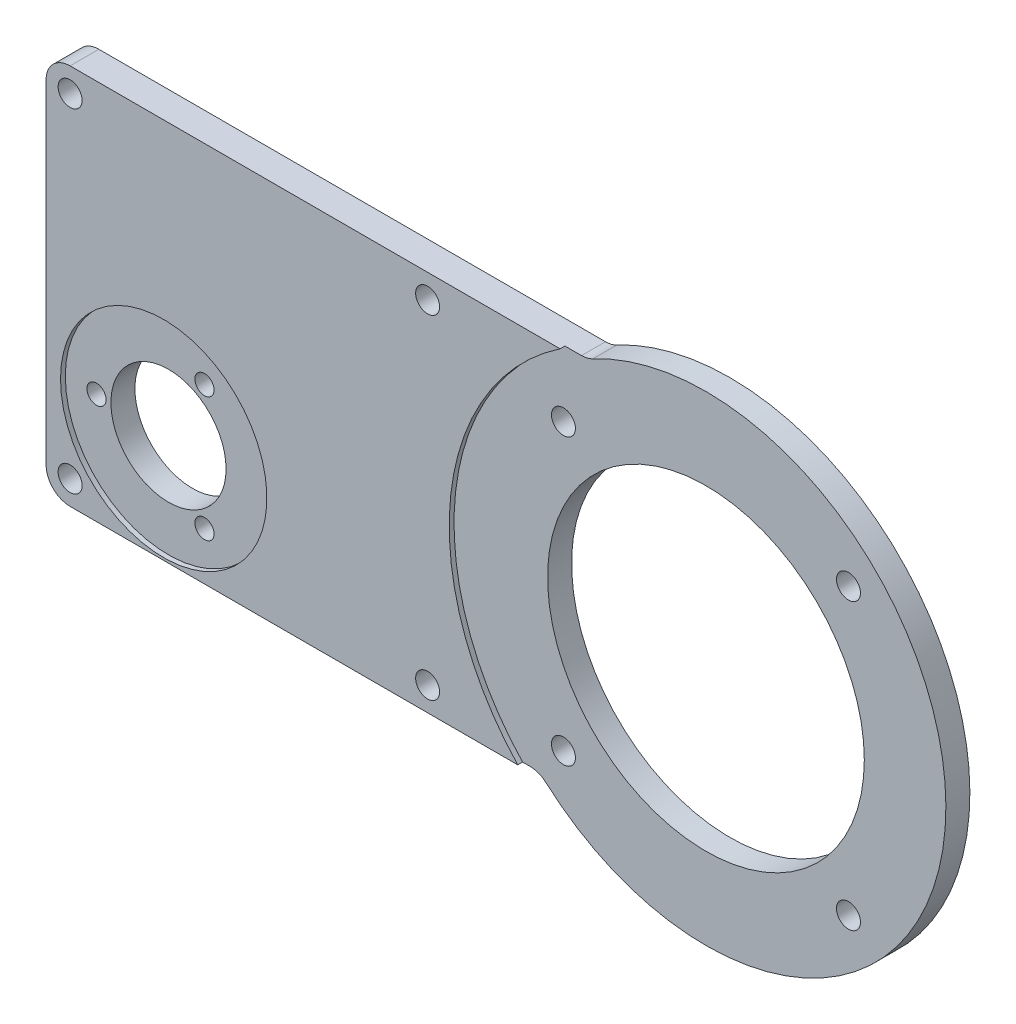
ISO-10303-21;
HEADER;
FILE_DESCRIPTION(('STEP AP214'),'2;1');
FILE_NAME('part.step','',(''),(''),'','','');
FILE_SCHEMA(('AUTOMOTIVE_DESIGN { 1 0 10303 214 1 1 1 1 }'));
ENDSEC;
DATA;
#1=APPLICATION_CONTEXT('core data for automotive mechanical design processes');
#2=APPLICATION_PROTOCOL_DEFINITION('international standard','automotive_design',2000,#1);
#3=PRODUCT_CONTEXT('',#1,'mechanical');
#4=PRODUCT('Part','Part','',(#3));
#5=PRODUCT_RELATED_PRODUCT_CATEGORY('part','',(#4));
#6=PRODUCT_DEFINITION_FORMATION('','',#4);
#7=PRODUCT_DEFINITION_CONTEXT('part definition',#1,'design');
#8=PRODUCT_DEFINITION('design','',#6,#7);
#9=PRODUCT_DEFINITION_SHAPE('','',#8);
#10=(LENGTH_UNIT() NAMED_UNIT(*) SI_UNIT(.MILLI.,.METRE.));
#11=(NAMED_UNIT(*) PLANE_ANGLE_UNIT() SI_UNIT($,.RADIAN.));
#12=(NAMED_UNIT(*) SI_UNIT($,.STERADIAN.) SOLID_ANGLE_UNIT());
#13=UNCERTAINTY_MEASURE_WITH_UNIT(LENGTH_MEASURE(1.E-05),#10,'distance_accuracy_value','');
#14=(GEOMETRIC_REPRESENTATION_CONTEXT(3) GLOBAL_UNCERTAINTY_ASSIGNED_CONTEXT((#13)) GLOBAL_UNIT_ASSIGNED_CONTEXT((#10,
#11,#12)) REPRESENTATION_CONTEXT('',''));
#15=CARTESIAN_POINT('',(0.,0.,0.));
#16=DIRECTION('',(0.,0.,1.));
#17=DIRECTION('',(1.,0.,0.));
#18=AXIS2_PLACEMENT_3D('',#15,#16,#17);
#19=CARTESIAN_POINT('',(-224.,-28.,10.));
#20=DIRECTION('',(0.,0.,-1.));
#21=DIRECTION('',(-1.,0.,0.));
#22=AXIS2_PLACEMENT_3D('',#19,#20,#21);
#23=PLANE('',#22);
#24=CARTESIAN_POINT('',(-209.,-53.9807621135,10.));
#25=DIRECTION('',(0.,0.,1.));
#26=DIRECTION('',(1.,0.,0.));
#27=AXIS2_PLACEMENT_3D('',#24,#25,#26);
#28=CIRCLE('',#27,4.);
#29=CARTESIAN_POINT('',(-205.,-53.9807621135,10.));
#30=VERTEX_POINT('',#29);
#31=EDGE_CURVE('E335',#30,#30,#28,.T.);
#32=ORIENTED_EDGE('',*,*,#31,.F.);
#33=EDGE_LOOP('',(#32));
#34=FACE_BOUND('',#33,.T.);
#35=CARTESIAN_POINT('',(-209.,-2.01923788647,10.));
#36=DIRECTION('',(0.,0.,1.));
#37=DIRECTION('',(1.,0.,0.));
#38=AXIS2_PLACEMENT_3D('',#35,#36,#37);
#39=CIRCLE('',#38,4.);
#40=CARTESIAN_POINT('',(-205.,-2.01923788647,10.));
#41=VERTEX_POINT('',#40);
#42=EDGE_CURVE('E323',#41,#41,#39,.T.);
#43=ORIENTED_EDGE('',*,*,#42,.F.);
#44=EDGE_LOOP('',(#43));
#45=FACE_BOUND('',#44,.T.);
#46=CARTESIAN_POINT('',(-224.,-28.,10.));
#47=DIRECTION('',(0.,0.,1.));
#48=DIRECTION('',(-1.,0.,0.));
#49=AXIS2_PLACEMENT_3D('',#46,#47,#48);
#50=CIRCLE('',#49,43.);
#51=CARTESIAN_POINT('',(-267.,-28.,10.));
#52=VERTEX_POINT('',#51);
#53=EDGE_CURVE('E119',#52,#52,#50,.T.);
#54=ORIENTED_EDGE('',*,*,#53,.T.);
#55=EDGE_LOOP('',(#54));
#56=FACE_BOUND('',#55,.T.);
#57=CARTESIAN_POINT('',(-254.,-28.,10.));
#58=DIRECTION('',(0.,0.,1.));
#59=DIRECTION('',(1.,0.,0.));
#60=AXIS2_PLACEMENT_3D('',#57,#58,#59);
#61=CIRCLE('',#60,4.);
#62=CARTESIAN_POINT('',(-250.,-28.,10.));
#63=VERTEX_POINT('',#62);
#64=EDGE_CURVE('E329',#63,#63,#61,.T.);
#65=ORIENTED_EDGE('',*,*,#64,.F.);
#66=EDGE_LOOP('',(#65));
#67=FACE_BOUND('',#66,.T.);
#68=CARTESIAN_POINT('',(-224.,-28.,10.));
#69=DIRECTION('',(0.,0.,1.));
#70=DIRECTION('',(1.,0.,0.));
#71=AXIS2_PLACEMENT_3D('',#68,#69,#70);
#72=CIRCLE('',#71,24.);
#73=CARTESIAN_POINT('',(-200.,-28.,10.));
#74=VERTEX_POINT('',#73);
#75=EDGE_CURVE('E341',#74,#74,#72,.T.);
#76=ORIENTED_EDGE('',*,*,#75,.F.);
#77=EDGE_LOOP('',(#76));
#78=FACE_BOUND('',#77,.T.);
#79=ADVANCED_FACE('F35',(#34,#45,#56,#67,#78),#23,.F.);
#80=CARTESIAN_POINT('',(-51.8748493973979,96.999999999996,12.));
#81=DIRECTION('',(0.,0.,-1.));
#82=DIRECTION('',(-1.,0.,0.));
#83=AXIS2_PLACEMENT_3D('',#80,#81,#82);
#84=CYLINDRICAL_SURFACE('',#83,10.0000000000066);
#85=DIRECTION('',(0.,0.,-1.));
#86=VECTOR('',#85,1.);
#87=CARTESIAN_POINT('',(-51.8748493973979,86.9999999999894,12.));
#88=LINE('',#87,#86);
#89=CARTESIAN_POINT('',(-51.8748493974,86.9999999999967,10.));
#90=VERTEX_POINT('',#89);
#91=CARTESIAN_POINT('',(-51.8748493973979,86.9999999999894,0.));
#92=VERTEX_POINT('',#91);
#93=EDGE_CURVE('E11',#90,#92,#88,.T.);
#94=ORIENTED_EDGE('',*,*,#93,.F.);
#95=CARTESIAN_POINT('',(-51.8748493974,97.,10.));
#96=DIRECTION('',(0.,0.,-1.));
#97=DIRECTION('',(-1.,0.,0.));
#98=AXIS2_PLACEMENT_3D('',#95,#96,#97);
#99=CIRCLE('',#98,10.0000000000033);
#100=CARTESIAN_POINT('',(-47.1589539976354,88.1818181818163,10.));
#101=VERTEX_POINT('',#100);
#102=EDGE_CURVE('E170',#101,#90,#99,.T.);
#103=ORIENTED_EDGE('',*,*,#102,.F.);
#104=DIRECTION('',(0.,0.,-1.));
#105=VECTOR('',#104,1.);
#106=CARTESIAN_POINT('',(-47.1589539976317,88.1818181818095,12.));
#107=LINE('',#106,#105);
#108=CARTESIAN_POINT('',(-47.1589539976317,88.1818181818095,0.));
#109=VERTEX_POINT('',#108);
#110=EDGE_CURVE('E39',#101,#109,#107,.T.);
#111=ORIENTED_EDGE('',*,*,#110,.T.);
#112=CARTESIAN_POINT('',(-51.8748493973979,96.999999999996,0.));
#113=DIRECTION('',(0.,0.,1.));
#114=DIRECTION('',(1.,0.,0.));
#115=AXIS2_PLACEMENT_3D('',#112,#113,#114);
#116=CIRCLE('',#115,10.0000000000066);
#117=EDGE_CURVE('E128',#92,#109,#116,.T.);
#118=ORIENTED_EDGE('',*,*,#117,.F.);
#119=EDGE_LOOP('',(#94,#103,#111,#118));
#120=FACE_BOUND('',#119,.T.);
#121=ADVANCED_FACE('F37',(#120),#84,.F.);
#122=CARTESIAN_POINT('',(-73.3212111193,-82.,12.));
#123=DIRECTION('',(0.,0.,-1.));
#124=DIRECTION('',(-1.,0.,0.));
#125=AXIS2_PLACEMENT_3D('',#122,#123,#124);
#126=CYLINDRICAL_SURFACE('',#125,10.000000000001);
#127=DIRECTION('',(0.,0.,-1.));
#128=VECTOR('',#127,1.);
#129=CARTESIAN_POINT('',(-66.6556464720898,-74.5454545454534,12.));
#130=LINE('',#129,#128);
#131=CARTESIAN_POINT('',(-66.655646472088,-74.5454545454552,10.));
#132=VERTEX_POINT('',#131);
#133=CARTESIAN_POINT('',(-66.6556464720898,-74.5454545454534,0.));
#134=VERTEX_POINT('',#133);
#135=EDGE_CURVE('E158',#132,#134,#130,.T.);
#136=ORIENTED_EDGE('',*,*,#135,.F.);
#137=CARTESIAN_POINT('',(-73.3212111192969,-82.0000000000017,10.));
#138=DIRECTION('',(0.,0.,-1.));
#139=DIRECTION('',(-1.,0.,0.));
#140=AXIS2_PLACEMENT_3D('',#137,#138,#139);
#141=CIRCLE('',#140,10.0000000000011);
#142=CARTESIAN_POINT('',(-73.3212111192969,-72.0000000000006,10.));
#143=VERTEX_POINT('',#142);
#144=EDGE_CURVE('E207',#143,#132,#141,.T.);
#145=ORIENTED_EDGE('',*,*,#144,.F.);
#146=DIRECTION('',(0.,0.,-1.));
#147=VECTOR('',#146,1.);
#148=CARTESIAN_POINT('',(-73.3212111193,-71.999999999999,12.));
#149=LINE('',#148,#147);
#150=CARTESIAN_POINT('',(-73.3212111193,-71.999999999999,0.));
#151=VERTEX_POINT('',#150);
#152=EDGE_CURVE('E157',#143,#151,#149,.T.);
#153=ORIENTED_EDGE('',*,*,#152,.T.);
#154=CARTESIAN_POINT('',(-73.3212111193,-82.,0.));
#155=DIRECTION('',(0.,0.,1.));
#156=DIRECTION('',(1.,0.,0.));
#157=AXIS2_PLACEMENT_3D('',#154,#155,#156);
#158=CIRCLE('',#157,10.000000000001);
#159=EDGE_CURVE('E176',#134,#151,#158,.T.);
#160=ORIENTED_EDGE('',*,*,#159,.F.);
#161=EDGE_LOOP('',(#136,#145,#153,#160));
#162=FACE_BOUND('',#161,.T.);
#163=ADVANCED_FACE('F211',(#162),#126,.F.);
#164=CARTESIAN_POINT('',(0.,0.,12.));
#165=DIRECTION('',(0.,0.,-1.));
#166=DIRECTION('',(-1.,0.,0.));
#167=AXIS2_PLACEMENT_3D('',#164,#165,#166);
#168=CYLINDRICAL_SURFACE('',#167,100.000000000002);
#169=ORIENTED_EDGE('',*,*,#110,.F.);
#170=CARTESIAN_POINT('',(-2.63331023653279E-12,4.92314522482218E-12,10.));
#171=DIRECTION('',(0.,0.,1.));
#172=DIRECTION('',(1.,0.,0.));
#173=AXIS2_PLACEMENT_3D('',#170,#171,#172);
#174=CIRCLE('',#173,100.000000000004);
#175=EDGE_CURVE('E118',#132,#101,#174,.T.);
#176=ORIENTED_EDGE('',*,*,#175,.F.);
#177=ORIENTED_EDGE('',*,*,#135,.T.);
#178=CARTESIAN_POINT('',(0.,0.,0.));
#179=DIRECTION('',(0.,0.,-1.));
#180=DIRECTION('',(-1.,0.,0.));
#181=AXIS2_PLACEMENT_3D('',#178,#179,#180);
#182=CIRCLE('',#181,100.000000000002);
#183=EDGE_CURVE('E172',#109,#134,#182,.T.);
#184=ORIENTED_EDGE('',*,*,#183,.F.);
#185=EDGE_LOOP('',(#169,#176,#177,#184));
#186=FACE_BOUND('',#185,.T.);
#187=ADVANCED_FACE('F173',(#186),#168,.T.);
#188=CARTESIAN_POINT('',(-262.999999999998,86.9999999999894,12.));
#189=DIRECTION('',(0.,1.,0.));
#190=DIRECTION('',(0.,0.,1.));
#191=AXIS2_PLACEMENT_3D('',#188,#189,#190);
#192=PLANE('',#191);
#193=DIRECTION('',(0.,0.,1.));
#194=VECTOR('',#193,1.);
#195=CARTESIAN_POINT('',(-58.7877538267981,86.9999999999967,10.));
#196=LINE('',#195,#194);
#197=CARTESIAN_POINT('',(-58.7877538267981,86.9999999999967,10.));
#198=VERTEX_POINT('',#197);
#199=CARTESIAN_POINT('',(-58.7877538267981,86.9999999999894,12.));
#200=VERTEX_POINT('',#199);
#201=EDGE_CURVE('E52',#198,#200,#196,.T.);
#202=ORIENTED_EDGE('',*,*,#201,.F.);
#203=DIRECTION('',(-1.,0.,0.));
#204=VECTOR('',#203,1.);
#205=CARTESIAN_POINT('',(-51.8748493974,86.9999999999967,10.));
#206=LINE('',#205,#204);
#207=EDGE_CURVE('E198',#90,#198,#206,.T.);
#208=ORIENTED_EDGE('',*,*,#207,.F.);
#209=ORIENTED_EDGE('',*,*,#93,.T.);
#210=DIRECTION('',(1.,0.,0.));
#211=VECTOR('',#210,1.);
#212=CARTESIAN_POINT('',(-262.999999999998,86.9999999999894,0.));
#213=LINE('',#212,#211);
#214=CARTESIAN_POINT('',(-262.999999999998,86.9999999999894,0.));
#215=VERTEX_POINT('',#214);
#216=EDGE_CURVE('E135',#215,#92,#213,.T.);
#217=ORIENTED_EDGE('',*,*,#216,.F.);
#218=DIRECTION('',(0.,0.,-1.));
#219=VECTOR('',#218,1.);
#220=CARTESIAN_POINT('',(-262.999999999998,86.9999999999894,12.));
#221=LINE('',#220,#219);
#222=CARTESIAN_POINT('',(-262.999999999998,86.9999999999894,12.));
#223=VERTEX_POINT('',#222);
#224=EDGE_CURVE('E44',#223,#215,#221,.T.);
#225=ORIENTED_EDGE('',*,*,#224,.F.);
#226=DIRECTION('',(1.,0.,0.));
#227=VECTOR('',#226,1.);
#228=CARTESIAN_POINT('',(-262.999999999998,86.9999999999894,12.));
#229=LINE('',#228,#227);
#230=EDGE_CURVE('E148',#223,#200,#229,.T.);
#231=ORIENTED_EDGE('',*,*,#230,.T.);
#232=EDGE_LOOP('',(#202,#208,#209,#217,#225,#231));
#233=FACE_BOUND('',#232,.T.);
#234=ADVANCED_FACE('F195',(#233),#192,.T.);
#235=CARTESIAN_POINT('',(-263.,76.9999999999894,12.));
#236=DIRECTION('',(0.,0.,-1.));
#237=DIRECTION('',(-1.,0.,0.));
#238=AXIS2_PLACEMENT_3D('',#235,#236,#237);
#239=CYLINDRICAL_SURFACE('',#238,10.);
#240=CARTESIAN_POINT('',(-263.,76.9999999999894,0.));
#241=DIRECTION('',(0.,0.,-1.));
#242=DIRECTION('',(-1.,0.,0.));
#243=AXIS2_PLACEMENT_3D('',#240,#241,#242);
#244=CIRCLE('',#243,10.);
#245=CARTESIAN_POINT('',(-273.,76.9999999999894,0.));
#246=VERTEX_POINT('',#245);
#247=EDGE_CURVE('E140',#246,#215,#244,.T.);
#248=ORIENTED_EDGE('',*,*,#247,.F.);
#249=DIRECTION('',(0.,0.,-1.));
#250=VECTOR('',#249,1.);
#251=CARTESIAN_POINT('',(-273.,76.9999999999894,12.));
#252=LINE('',#251,#250);
#253=CARTESIAN_POINT('',(-273.,76.9999999999894,12.));
#254=VERTEX_POINT('',#253);
#255=EDGE_CURVE('E151',#254,#246,#252,.T.);
#256=ORIENTED_EDGE('',*,*,#255,.F.);
#257=CARTESIAN_POINT('',(-263.,76.9999999999894,12.));
#258=DIRECTION('',(0.,0.,-1.));
#259=DIRECTION('',(-1.,0.,0.));
#260=AXIS2_PLACEMENT_3D('',#257,#258,#259);
#261=CIRCLE('',#260,10.);
#262=EDGE_CURVE('E146',#254,#223,#261,.T.);
#263=ORIENTED_EDGE('',*,*,#262,.T.);
#264=ORIENTED_EDGE('',*,*,#224,.T.);
#265=EDGE_LOOP('',(#248,#256,#263,#264));
#266=FACE_BOUND('',#265,.T.);
#267=ADVANCED_FACE('F219',(#266),#239,.T.);
#268=CARTESIAN_POINT('',(-273.,-62.,12.));
#269=DIRECTION('',(-1.,0.,0.));
#270=DIRECTION('',(0.,0.,1.));
#271=AXIS2_PLACEMENT_3D('',#268,#269,#270);
#272=PLANE('',#271);
#273=DIRECTION('',(0.,1.,0.));
#274=VECTOR('',#273,1.);
#275=CARTESIAN_POINT('',(-273.,-62.,0.));
#276=LINE('',#275,#274);
#277=CARTESIAN_POINT('',(-273.,-62.,0.));
#278=VERTEX_POINT('',#277);
#279=EDGE_CURVE('E190',#278,#246,#276,.T.);
#280=ORIENTED_EDGE('',*,*,#279,.F.);
#281=DIRECTION('',(0.,0.,-1.));
#282=VECTOR('',#281,1.);
#283=CARTESIAN_POINT('',(-273.,-62.,12.));
#284=LINE('',#283,#282);
#285=CARTESIAN_POINT('',(-273.,-62.,12.));
#286=VERTEX_POINT('',#285);
#287=EDGE_CURVE('E153',#286,#278,#284,.T.);
#288=ORIENTED_EDGE('',*,*,#287,.F.);
#289=DIRECTION('',(0.,1.,0.));
#290=VECTOR('',#289,1.);
#291=CARTESIAN_POINT('',(-273.,-62.,12.));
#292=LINE('',#291,#290);
#293=EDGE_CURVE('E137',#286,#254,#292,.T.);
#294=ORIENTED_EDGE('',*,*,#293,.T.);
#295=ORIENTED_EDGE('',*,*,#255,.T.);
#296=EDGE_LOOP('',(#280,#288,#294,#295));
#297=FACE_BOUND('',#296,.T.);
#298=ADVANCED_FACE('F217',(#297),#272,.T.);
#299=CARTESIAN_POINT('',(-263.,-62.,12.));
#300=DIRECTION('',(0.,0.,-1.));
#301=DIRECTION('',(-1.,0.,0.));
#302=AXIS2_PLACEMENT_3D('',#299,#300,#301);
#303=CYLINDRICAL_SURFACE('',#302,10.);
#304=CARTESIAN_POINT('',(-263.,-62.,0.));
#305=DIRECTION('',(0.,0.,-1.));
#306=DIRECTION('',(-1.,0.,0.));
#307=AXIS2_PLACEMENT_3D('',#304,#305,#306);
#308=CIRCLE('',#307,10.);
#309=CARTESIAN_POINT('',(-263.,-72.,0.));
#310=VERTEX_POINT('',#309);
#311=EDGE_CURVE('E187',#310,#278,#308,.T.);
#312=ORIENTED_EDGE('',*,*,#311,.F.);
#313=DIRECTION('',(0.,0.,-1.));
#314=VECTOR('',#313,1.);
#315=CARTESIAN_POINT('',(-263.,-72.,12.));
#316=LINE('',#315,#314);
#317=CARTESIAN_POINT('',(-263.,-72.,12.));
#318=VERTEX_POINT('',#317);
#319=EDGE_CURVE('E155',#318,#310,#316,.T.);
#320=ORIENTED_EDGE('',*,*,#319,.F.);
#321=CARTESIAN_POINT('',(-263.,-62.,12.));
#322=DIRECTION('',(0.,0.,-1.));
#323=DIRECTION('',(-1.,0.,0.));
#324=AXIS2_PLACEMENT_3D('',#321,#322,#323);
#325=CIRCLE('',#324,10.);
#326=EDGE_CURVE('E134',#318,#286,#325,.T.);
#327=ORIENTED_EDGE('',*,*,#326,.T.);
#328=ORIENTED_EDGE('',*,*,#287,.T.);
#329=EDGE_LOOP('',(#312,#320,#327,#328));
#330=FACE_BOUND('',#329,.T.);
#331=ADVANCED_FACE('F215',(#330),#303,.T.);
#332=CARTESIAN_POINT('',(-73.3212111193,-72.,12.));
#333=DIRECTION('',(0.,-1.,0.));
#334=DIRECTION('',(0.,0.,-1.));
#335=AXIS2_PLACEMENT_3D('',#332,#333,#334);
#336=PLANE('',#335);
#337=DIRECTION('',(0.,0.,1.));
#338=VECTOR('',#337,1.);
#339=CARTESIAN_POINT('',(-76.4264352171294,-72.0000000000006,10.));
#340=LINE('',#339,#338);
#341=CARTESIAN_POINT('',(-76.4264352171294,-72.0000000000006,10.));
#342=VERTEX_POINT('',#341);
#343=CARTESIAN_POINT('',(-76.4264352171294,-72.0000000000006,12.));
#344=VERTEX_POINT('',#343);
#345=EDGE_CURVE('E113',#342,#344,#340,.T.);
#346=ORIENTED_EDGE('',*,*,#345,.T.);
#347=DIRECTION('',(-1.,0.,0.));
#348=VECTOR('',#347,1.);
#349=CARTESIAN_POINT('',(-73.3212111193,-72.,12.));
#350=LINE('',#349,#348);
#351=EDGE_CURVE('E124',#344,#318,#350,.T.);
#352=ORIENTED_EDGE('',*,*,#351,.T.);
#353=ORIENTED_EDGE('',*,*,#319,.T.);
#354=DIRECTION('',(-1.,0.,0.));
#355=VECTOR('',#354,1.);
#356=CARTESIAN_POINT('',(-73.3212111193,-72.,0.));
#357=LINE('',#356,#355);
#358=EDGE_CURVE('E184',#151,#310,#357,.T.);
#359=ORIENTED_EDGE('',*,*,#358,.F.);
#360=ORIENTED_EDGE('',*,*,#152,.F.);
#361=DIRECTION('',(1.,0.,0.));
#362=VECTOR('',#361,1.);
#363=CARTESIAN_POINT('',(-76.4264352171294,-72.0000000000006,10.));
#364=LINE('',#363,#362);
#365=EDGE_CURVE('E127',#342,#143,#364,.T.);
#366=ORIENTED_EDGE('',*,*,#365,.F.);
#367=EDGE_LOOP('',(#346,#352,#353,#359,#360,#366));
#368=FACE_BOUND('',#367,.T.);
#369=ADVANCED_FACE('F123',(#368),#336,.T.);
#370=CARTESIAN_POINT('',(-51.8748493973979,96.999999999996,12.));
#371=DIRECTION('',(0.,0.,1.));
#372=DIRECTION('',(1.,0.,0.));
#373=AXIS2_PLACEMENT_3D('',#370,#371,#372);
#374=PLANE('',#373);
#375=CARTESIAN_POINT('',(-263.,77.,12.));
#376=DIRECTION('',(0.,0.,1.));
#377=DIRECTION('',(1.,0.,0.));
#378=AXIS2_PLACEMENT_3D('',#375,#376,#377);
#379=CIRCLE('',#378,5.);
#380=CARTESIAN_POINT('',(-258.,77.,12.));
#381=VERTEX_POINT('',#380);
#382=EDGE_CURVE('E261',#381,#381,#379,.T.);
#383=ORIENTED_EDGE('',*,*,#382,.F.);
#384=EDGE_LOOP('',(#383));
#385=FACE_BOUND('',#384,.T.);
#386=CARTESIAN_POINT('',(-263.,-62.,12.));
#387=DIRECTION('',(0.,0.,1.));
#388=DIRECTION('',(1.,0.,0.));
#389=AXIS2_PLACEMENT_3D('',#386,#387,#388);
#390=CIRCLE('',#389,5.);
#391=CARTESIAN_POINT('',(-258.,-62.,12.));
#392=VERTEX_POINT('',#391);
#393=EDGE_CURVE('E265',#392,#392,#390,.T.);
#394=ORIENTED_EDGE('',*,*,#393,.F.);
#395=EDGE_LOOP('',(#394));
#396=FACE_BOUND('',#395,.T.);
#397=CARTESIAN_POINT('',(-114.,-62.,12.));
#398=DIRECTION('',(0.,0.,1.));
#399=DIRECTION('',(1.,0.,0.));
#400=AXIS2_PLACEMENT_3D('',#397,#398,#399);
#401=CIRCLE('',#400,4.99999999999999);
#402=CARTESIAN_POINT('',(-109.,-62.,12.));
#403=VERTEX_POINT('',#402);
#404=EDGE_CURVE('E269',#403,#403,#401,.T.);
#405=ORIENTED_EDGE('',*,*,#404,.F.);
#406=EDGE_LOOP('',(#405));
#407=FACE_BOUND('',#406,.T.);
#408=CARTESIAN_POINT('',(-114.,77.,12.));
#409=DIRECTION('',(0.,0.,1.));
#410=DIRECTION('',(1.,0.,0.));
#411=AXIS2_PLACEMENT_3D('',#408,#409,#410);
#412=CIRCLE('',#411,4.99999999999999);
#413=CARTESIAN_POINT('',(-109.,77.,12.));
#414=VERTEX_POINT('',#413);
#415=EDGE_CURVE('E273',#414,#414,#412,.T.);
#416=ORIENTED_EDGE('',*,*,#415,.F.);
#417=EDGE_LOOP('',(#416));
#418=FACE_BOUND('',#417,.T.);
#419=CARTESIAN_POINT('',(-224.,-28.,12.));
#420=DIRECTION('',(0.,0.,1.));
#421=DIRECTION('',(-1.,0.,0.));
#422=AXIS2_PLACEMENT_3D('',#419,#420,#421);
#423=CIRCLE('',#422,43.);
#424=CARTESIAN_POINT('',(-267.,-28.,12.));
#425=VERTEX_POINT('',#424);
#426=EDGE_CURVE('E276',#425,#425,#423,.T.);
#427=ORIENTED_EDGE('',*,*,#426,.F.);
#428=EDGE_LOOP('',(#427));
#429=FACE_BOUND('',#428,.T.);
#430=CARTESIAN_POINT('',(-2.63331023653279E-12,4.92314522482218E-12,12.));
#431=DIRECTION('',(0.,0.,1.));
#432=DIRECTION('',(1.,0.,0.));
#433=AXIS2_PLACEMENT_3D('',#430,#431,#432);
#434=CIRCLE('',#433,104.999999999993);
#435=EDGE_CURVE('E110',#200,#344,#434,.T.);
#436=ORIENTED_EDGE('',*,*,#435,.F.);
#437=ORIENTED_EDGE('',*,*,#230,.F.);
#438=ORIENTED_EDGE('',*,*,#262,.F.);
#439=ORIENTED_EDGE('',*,*,#293,.F.);
#440=ORIENTED_EDGE('',*,*,#326,.F.);
#441=ORIENTED_EDGE('',*,*,#351,.F.);
#442=EDGE_LOOP('',(#436,#437,#438,#439,#440,#441));
#443=FACE_BOUND('',#442,.T.);
#444=ADVANCED_FACE('F131',(#385,#396,#407,#418,#429,#443),#374,.T.);
#445=CARTESIAN_POINT('',(-51.8748493973979,96.999999999996,0.));
#446=DIRECTION('',(0.,0.,1.));
#447=DIRECTION('',(1.,0.,0.));
#448=AXIS2_PLACEMENT_3D('',#445,#446,#447);
#449=PLANE('',#448);
#450=CARTESIAN_POINT('',(-263.,77.,0.));
#451=DIRECTION('',(0.,0.,1.));
#452=DIRECTION('',(1.,0.,0.));
#453=AXIS2_PLACEMENT_3D('',#450,#451,#452);
#454=CIRCLE('',#453,5.);
#455=CARTESIAN_POINT('',(-258.,77.,0.));
#456=VERTEX_POINT('',#455);
#457=EDGE_CURVE('E348',#456,#456,#454,.T.);
#458=ORIENTED_EDGE('',*,*,#457,.T.);
#459=EDGE_LOOP('',(#458));
#460=FACE_BOUND('',#459,.T.);
#461=CARTESIAN_POINT('',(-263.,-62.,0.));
#462=DIRECTION('',(0.,0.,1.));
#463=DIRECTION('',(1.,0.,0.));
#464=AXIS2_PLACEMENT_3D('',#461,#462,#463);
#465=CIRCLE('',#464,5.);
#466=CARTESIAN_POINT('',(-258.,-62.,0.));
#467=VERTEX_POINT('',#466);
#468=EDGE_CURVE('E344',#467,#467,#465,.T.);
#469=ORIENTED_EDGE('',*,*,#468,.T.);
#470=EDGE_LOOP('',(#469));
#471=FACE_BOUND('',#470,.T.);
#472=CARTESIAN_POINT('',(-224.,-28.,0.));
#473=DIRECTION('',(0.,0.,1.));
#474=DIRECTION('',(1.,0.,0.));
#475=AXIS2_PLACEMENT_3D('',#472,#473,#474);
#476=CIRCLE('',#475,24.);
#477=CARTESIAN_POINT('',(-200.,-28.,0.));
#478=VERTEX_POINT('',#477);
#479=EDGE_CURVE('E338',#478,#478,#476,.T.);
#480=ORIENTED_EDGE('',*,*,#479,.T.);
#481=EDGE_LOOP('',(#480));
#482=FACE_BOUND('',#481,.T.);
#483=CARTESIAN_POINT('',(-209.,-53.9807621135,0.));
#484=DIRECTION('',(0.,0.,1.));
#485=DIRECTION('',(1.,0.,0.));
#486=AXIS2_PLACEMENT_3D('',#483,#484,#485);
#487=CIRCLE('',#486,4.);
#488=CARTESIAN_POINT('',(-205.,-53.9807621135,0.));
#489=VERTEX_POINT('',#488);
#490=EDGE_CURVE('E332',#489,#489,#487,.T.);
#491=ORIENTED_EDGE('',*,*,#490,.T.);
#492=EDGE_LOOP('',(#491));
#493=FACE_BOUND('',#492,.T.);
#494=CARTESIAN_POINT('',(-254.,-28.,0.));
#495=DIRECTION('',(0.,0.,1.));
#496=DIRECTION('',(1.,0.,0.));
#497=AXIS2_PLACEMENT_3D('',#494,#495,#496);
#498=CIRCLE('',#497,4.);
#499=CARTESIAN_POINT('',(-250.,-28.,0.));
#500=VERTEX_POINT('',#499);
#501=EDGE_CURVE('E326',#500,#500,#498,.T.);
#502=ORIENTED_EDGE('',*,*,#501,.T.);
#503=EDGE_LOOP('',(#502));
#504=FACE_BOUND('',#503,.T.);
#505=CARTESIAN_POINT('',(-209.,-2.01923788647,0.));
#506=DIRECTION('',(0.,0.,1.));
#507=DIRECTION('',(1.,0.,0.));
#508=AXIS2_PLACEMENT_3D('',#505,#506,#507);
#509=CIRCLE('',#508,4.);
#510=CARTESIAN_POINT('',(-205.,-2.01923788647,0.));
#511=VERTEX_POINT('',#510);
#512=EDGE_CURVE('E320',#511,#511,#509,.T.);
#513=ORIENTED_EDGE('',*,*,#512,.T.);
#514=EDGE_LOOP('',(#513));
#515=FACE_BOUND('',#514,.T.);
#516=CARTESIAN_POINT('',(-114.,-62.,0.));
#517=DIRECTION('',(0.,0.,1.));
#518=DIRECTION('',(1.,0.,0.));
#519=AXIS2_PLACEMENT_3D('',#516,#517,#518);
#520=CIRCLE('',#519,5.);
#521=CARTESIAN_POINT('',(-109.,-62.,0.));
#522=VERTEX_POINT('',#521);
#523=EDGE_CURVE('E316',#522,#522,#520,.T.);
#524=ORIENTED_EDGE('',*,*,#523,.T.);
#525=EDGE_LOOP('',(#524));
#526=FACE_BOUND('',#525,.T.);
#527=CARTESIAN_POINT('',(-59.3969696197,-59.3969696197,0.));
#528=DIRECTION('',(0.,0.,1.));
#529=DIRECTION('',(1.,0.,0.));
#530=AXIS2_PLACEMENT_3D('',#527,#528,#529);
#531=CIRCLE('',#530,4.99999999999999);
#532=CARTESIAN_POINT('',(-54.3969696197,-59.3969696197,0.));
#533=VERTEX_POINT('',#532);
#534=EDGE_CURVE('E310',#533,#533,#531,.T.);
#535=ORIENTED_EDGE('',*,*,#534,.T.);
#536=EDGE_LOOP('',(#535));
#537=FACE_BOUND('',#536,.T.);
#538=CARTESIAN_POINT('',(0.,0.,0.));
#539=DIRECTION('',(0.,0.,1.));
#540=DIRECTION('',(1.,0.,0.));
#541=AXIS2_PLACEMENT_3D('',#538,#539,#540);
#542=CIRCLE('',#541,66.);
#543=CARTESIAN_POINT('',(66.,0.,0.));
#544=VERTEX_POINT('',#543);
#545=EDGE_CURVE('E304',#544,#544,#542,.T.);
#546=ORIENTED_EDGE('',*,*,#545,.T.);
#547=EDGE_LOOP('',(#546));
#548=FACE_BOUND('',#547,.T.);
#549=CARTESIAN_POINT('',(-59.3969696197,59.3969696197,0.));
#550=DIRECTION('',(0.,0.,1.));
#551=DIRECTION('',(1.,0.,0.));
#552=AXIS2_PLACEMENT_3D('',#549,#550,#551);
#553=CIRCLE('',#552,4.99999999999999);
#554=CARTESIAN_POINT('',(-54.3969696197,59.3969696197,0.));
#555=VERTEX_POINT('',#554);
#556=EDGE_CURVE('E298',#555,#555,#553,.T.);
#557=ORIENTED_EDGE('',*,*,#556,.T.);
#558=EDGE_LOOP('',(#557));
#559=FACE_BOUND('',#558,.T.);
#560=CARTESIAN_POINT('',(-114.,77.,0.));
#561=DIRECTION('',(0.,0.,1.));
#562=DIRECTION('',(1.,0.,0.));
#563=AXIS2_PLACEMENT_3D('',#560,#561,#562);
#564=CIRCLE('',#563,5.);
#565=CARTESIAN_POINT('',(-109.,77.,0.));
#566=VERTEX_POINT('',#565);
#567=EDGE_CURVE('E294',#566,#566,#564,.T.);
#568=ORIENTED_EDGE('',*,*,#567,.T.);
#569=EDGE_LOOP('',(#568));
#570=FACE_BOUND('',#569,.T.);
#571=CARTESIAN_POINT('',(59.3969696197,59.3969696197,0.));
#572=DIRECTION('',(0.,0.,1.));
#573=DIRECTION('',(1.,0.,0.));
#574=AXIS2_PLACEMENT_3D('',#571,#572,#573);
#575=CIRCLE('',#574,4.99999999999999);
#576=CARTESIAN_POINT('',(64.3969696197,59.3969696197,0.));
#577=VERTEX_POINT('',#576);
#578=EDGE_CURVE('E288',#577,#577,#575,.T.);
#579=ORIENTED_EDGE('',*,*,#578,.T.);
#580=EDGE_LOOP('',(#579));
#581=FACE_BOUND('',#580,.T.);
#582=CARTESIAN_POINT('',(59.3969696197,-59.3969696197,0.));
#583=DIRECTION('',(0.,0.,1.));
#584=DIRECTION('',(1.,0.,0.));
#585=AXIS2_PLACEMENT_3D('',#582,#583,#584);
#586=CIRCLE('',#585,4.99999999999999);
#587=CARTESIAN_POINT('',(64.3969696197,-59.3969696197,0.));
#588=VERTEX_POINT('',#587);
#589=EDGE_CURVE('E278',#588,#588,#586,.T.);
#590=ORIENTED_EDGE('',*,*,#589,.T.);
#591=EDGE_LOOP('',(#590));
#592=FACE_BOUND('',#591,.T.);
#593=ORIENTED_EDGE('',*,*,#117,.T.);
#594=ORIENTED_EDGE('',*,*,#183,.T.);
#595=ORIENTED_EDGE('',*,*,#159,.T.);
#596=ORIENTED_EDGE('',*,*,#358,.T.);
#597=ORIENTED_EDGE('',*,*,#311,.T.);
#598=ORIENTED_EDGE('',*,*,#279,.T.);
#599=ORIENTED_EDGE('',*,*,#247,.T.);
#600=ORIENTED_EDGE('',*,*,#216,.T.);
#601=EDGE_LOOP('',(#593,#594,#595,#596,#597,#598,#599,#600));
#602=FACE_BOUND('',#601,.T.);
#603=ADVANCED_FACE('F178',(#460,#471,#482,#493,#504,#515,#526,#537,#548,#559,#570,#581,#592,
#602),#449,.F.);
#604=CARTESIAN_POINT('',(-2.63331023653279E-12,4.92314522482218E-12,10.));
#605=DIRECTION('',(0.,0.,1.));
#606=DIRECTION('',(1.,0.,0.));
#607=AXIS2_PLACEMENT_3D('',#604,#605,#606);
#608=CYLINDRICAL_SURFACE('',#607,104.999999999993);
#609=ORIENTED_EDGE('',*,*,#435,.T.);
#610=ORIENTED_EDGE('',*,*,#345,.F.);
#611=CARTESIAN_POINT('',(-2.63331023653279E-12,4.92314522482218E-12,10.));
#612=DIRECTION('',(0.,0.,1.));
#613=DIRECTION('',(1.,0.,0.));
#614=AXIS2_PLACEMENT_3D('',#611,#612,#613);
#615=CIRCLE('',#614,104.999999999993);
#616=EDGE_CURVE('E200',#198,#342,#615,.T.);
#617=ORIENTED_EDGE('',*,*,#616,.F.);
#618=ORIENTED_EDGE('',*,*,#201,.T.);
#619=EDGE_LOOP('',(#609,#610,#617,#618));
#620=FACE_BOUND('',#619,.T.);
#621=ADVANCED_FACE('F112',(#620),#608,.F.);
#622=CARTESIAN_POINT('',(-2.63331023653279E-12,4.92314522482218E-12,10.));
#623=DIRECTION('',(0.,0.,1.));
#624=DIRECTION('',(1.,0.,0.));
#625=AXIS2_PLACEMENT_3D('',#622,#623,#624);
#626=PLANE('',#625);
#627=CARTESIAN_POINT('',(-59.3969696197,-59.3969696197,10.));
#628=DIRECTION('',(0.,0.,1.));
#629=DIRECTION('',(1.,0.,0.));
#630=AXIS2_PLACEMENT_3D('',#627,#628,#629);
#631=CIRCLE('',#630,4.99999999999998);
#632=CARTESIAN_POINT('',(-54.3969696197,-59.3969696197,10.));
#633=VERTEX_POINT('',#632);
#634=EDGE_CURVE('E313',#633,#633,#631,.T.);
#635=ORIENTED_EDGE('',*,*,#634,.F.);
#636=EDGE_LOOP('',(#635));
#637=FACE_BOUND('',#636,.T.);
#638=CARTESIAN_POINT('',(0.,0.,9.99999999999999));
#639=DIRECTION('',(0.,0.,1.));
#640=DIRECTION('',(1.,0.,0.));
#641=AXIS2_PLACEMENT_3D('',#638,#639,#640);
#642=CIRCLE('',#641,66.);
#643=CARTESIAN_POINT('',(66.,0.,9.99999999999999));
#644=VERTEX_POINT('',#643);
#645=EDGE_CURVE('E307',#644,#644,#642,.T.);
#646=ORIENTED_EDGE('',*,*,#645,.F.);
#647=EDGE_LOOP('',(#646));
#648=FACE_BOUND('',#647,.T.);
#649=CARTESIAN_POINT('',(-59.3969696197,59.3969696197,10.));
#650=DIRECTION('',(0.,0.,1.));
#651=DIRECTION('',(1.,0.,0.));
#652=AXIS2_PLACEMENT_3D('',#649,#650,#651);
#653=CIRCLE('',#652,4.99999999999998);
#654=CARTESIAN_POINT('',(-54.3969696197,59.3969696197,10.));
#655=VERTEX_POINT('',#654);
#656=EDGE_CURVE('E301',#655,#655,#653,.T.);
#657=ORIENTED_EDGE('',*,*,#656,.F.);
#658=EDGE_LOOP('',(#657));
#659=FACE_BOUND('',#658,.T.);
#660=CARTESIAN_POINT('',(59.3969696197,59.3969696197,10.));
#661=DIRECTION('',(0.,0.,1.));
#662=DIRECTION('',(1.,0.,0.));
#663=AXIS2_PLACEMENT_3D('',#660,#661,#662);
#664=CIRCLE('',#663,4.99999999999998);
#665=CARTESIAN_POINT('',(64.3969696197,59.3969696197,10.));
#666=VERTEX_POINT('',#665);
#667=EDGE_CURVE('E291',#666,#666,#664,.T.);
#668=ORIENTED_EDGE('',*,*,#667,.F.);
#669=EDGE_LOOP('',(#668));
#670=FACE_BOUND('',#669,.T.);
#671=CARTESIAN_POINT('',(59.3969696197,-59.3969696197,10.));
#672=DIRECTION('',(0.,0.,1.));
#673=DIRECTION('',(1.,0.,0.));
#674=AXIS2_PLACEMENT_3D('',#671,#672,#673);
#675=CIRCLE('',#674,4.99999999999998);
#676=CARTESIAN_POINT('',(64.3969696197,-59.3969696197,10.));
#677=VERTEX_POINT('',#676);
#678=EDGE_CURVE('E283',#677,#677,#675,.T.);
#679=ORIENTED_EDGE('',*,*,#678,.F.);
#680=EDGE_LOOP('',(#679));
#681=FACE_BOUND('',#680,.T.);
#682=ORIENTED_EDGE('',*,*,#175,.T.);
#683=ORIENTED_EDGE('',*,*,#102,.T.);
#684=ORIENTED_EDGE('',*,*,#207,.T.);
#685=ORIENTED_EDGE('',*,*,#616,.T.);
#686=ORIENTED_EDGE('',*,*,#365,.T.);
#687=ORIENTED_EDGE('',*,*,#144,.T.);
#688=EDGE_LOOP('',(#682,#683,#684,#685,#686,#687));
#689=FACE_BOUND('',#688,.T.);
#690=ADVANCED_FACE('F209',(#637,#648,#659,#670,#681,#689),#626,.T.);
#691=CARTESIAN_POINT('',(-224.,-28.,10.));
#692=DIRECTION('',(0.,0.,1.));
#693=DIRECTION('',(1.,0.,0.));
#694=AXIS2_PLACEMENT_3D('',#691,#692,#693);
#695=CYLINDRICAL_SURFACE('',#694,43.);
#696=ORIENTED_EDGE('',*,*,#53,.F.);
#697=EDGE_LOOP('',(#696));
#698=FACE_BOUND('',#697,.T.);
#699=ORIENTED_EDGE('',*,*,#426,.T.);
#700=EDGE_LOOP('',(#699));
#701=FACE_BOUND('',#700,.T.);
#702=ADVANCED_FACE('F240',(#698,#701),#695,.F.);
#703=CARTESIAN_POINT('',(59.3969696197,-59.3969696197,10.));
#704=DIRECTION('',(0.,0.,1.));
#705=DIRECTION('',(1.,0.,0.));
#706=AXIS2_PLACEMENT_3D('',#703,#704,#705);
#707=CYLINDRICAL_SURFACE('',#706,4.99999999999999);
#708=ORIENTED_EDGE('',*,*,#589,.F.);
#709=EDGE_LOOP('',(#708));
#710=FACE_BOUND('',#709,.T.);
#711=ORIENTED_EDGE('',*,*,#678,.T.);
#712=EDGE_LOOP('',(#711));
#713=FACE_BOUND('',#712,.T.);
#714=ADVANCED_FACE('F238',(#710,#713),#707,.F.);
#715=CARTESIAN_POINT('',(59.3969696197,59.3969696197,10.));
#716=DIRECTION('',(0.,0.,1.));
#717=DIRECTION('',(1.,0.,0.));
#718=AXIS2_PLACEMENT_3D('',#715,#716,#717);
#719=CYLINDRICAL_SURFACE('',#718,4.99999999999999);
#720=ORIENTED_EDGE('',*,*,#578,.F.);
#721=EDGE_LOOP('',(#720));
#722=FACE_BOUND('',#721,.T.);
#723=ORIENTED_EDGE('',*,*,#667,.T.);
#724=EDGE_LOOP('',(#723));
#725=FACE_BOUND('',#724,.T.);
#726=ADVANCED_FACE('F398',(#722,#725),#719,.F.);
#727=CARTESIAN_POINT('',(-114.,77.,12.));
#728=DIRECTION('',(0.,0.,1.));
#729=DIRECTION('',(1.,0.,0.));
#730=AXIS2_PLACEMENT_3D('',#727,#728,#729);
#731=CYLINDRICAL_SURFACE('',#730,5.);
#732=ORIENTED_EDGE('',*,*,#567,.F.);
#733=EDGE_LOOP('',(#732));
#734=FACE_BOUND('',#733,.T.);
#735=ORIENTED_EDGE('',*,*,#415,.T.);
#736=EDGE_LOOP('',(#735));
#737=FACE_BOUND('',#736,.T.);
#738=ADVANCED_FACE('F395',(#734,#737),#731,.F.);
#739=CARTESIAN_POINT('',(-59.3969696197,59.3969696197,10.));
#740=DIRECTION('',(0.,0.,1.));
#741=DIRECTION('',(1.,0.,0.));
#742=AXIS2_PLACEMENT_3D('',#739,#740,#741);
#743=CYLINDRICAL_SURFACE('',#742,4.99999999999999);
#744=ORIENTED_EDGE('',*,*,#556,.F.);
#745=EDGE_LOOP('',(#744));
#746=FACE_BOUND('',#745,.T.);
#747=ORIENTED_EDGE('',*,*,#656,.T.);
#748=EDGE_LOOP('',(#747));
#749=FACE_BOUND('',#748,.T.);
#750=ADVANCED_FACE('F391',(#746,#749),#743,.F.);
#751=CARTESIAN_POINT('',(0.,0.,10.));
#752=DIRECTION('',(0.,0.,1.));
#753=DIRECTION('',(1.,0.,0.));
#754=AXIS2_PLACEMENT_3D('',#751,#752,#753);
#755=CYLINDRICAL_SURFACE('',#754,66.);
#756=ORIENTED_EDGE('',*,*,#545,.F.);
#757=EDGE_LOOP('',(#756));
#758=FACE_BOUND('',#757,.T.);
#759=ORIENTED_EDGE('',*,*,#645,.T.);
#760=EDGE_LOOP('',(#759));
#761=FACE_BOUND('',#760,.T.);
#762=ADVANCED_FACE('F387',(#758,#761),#755,.F.);
#763=CARTESIAN_POINT('',(-59.3969696197,-59.3969696197,10.));
#764=DIRECTION('',(0.,0.,1.));
#765=DIRECTION('',(1.,0.,0.));
#766=AXIS2_PLACEMENT_3D('',#763,#764,#765);
#767=CYLINDRICAL_SURFACE('',#766,4.99999999999999);
#768=ORIENTED_EDGE('',*,*,#534,.F.);
#769=EDGE_LOOP('',(#768));
#770=FACE_BOUND('',#769,.T.);
#771=ORIENTED_EDGE('',*,*,#634,.T.);
#772=EDGE_LOOP('',(#771));
#773=FACE_BOUND('',#772,.T.);
#774=ADVANCED_FACE('F383',(#770,#773),#767,.F.);
#775=CARTESIAN_POINT('',(-114.,-62.,12.));
#776=DIRECTION('',(0.,0.,1.));
#777=DIRECTION('',(1.,0.,0.));
#778=AXIS2_PLACEMENT_3D('',#775,#776,#777);
#779=CYLINDRICAL_SURFACE('',#778,5.);
#780=ORIENTED_EDGE('',*,*,#523,.F.);
#781=EDGE_LOOP('',(#780));
#782=FACE_BOUND('',#781,.T.);
#783=ORIENTED_EDGE('',*,*,#404,.T.);
#784=EDGE_LOOP('',(#783));
#785=FACE_BOUND('',#784,.T.);
#786=ADVANCED_FACE('F379',(#782,#785),#779,.F.);
#787=CARTESIAN_POINT('',(-209.,-2.01923788647,10.));
#788=DIRECTION('',(0.,0.,1.));
#789=DIRECTION('',(1.,0.,0.));
#790=AXIS2_PLACEMENT_3D('',#787,#788,#789);
#791=CYLINDRICAL_SURFACE('',#790,4.);
#792=ORIENTED_EDGE('',*,*,#512,.F.);
#793=EDGE_LOOP('',(#792));
#794=FACE_BOUND('',#793,.T.);
#795=ORIENTED_EDGE('',*,*,#42,.T.);
#796=EDGE_LOOP('',(#795));
#797=FACE_BOUND('',#796,.T.);
#798=ADVANCED_FACE('F375',(#794,#797),#791,.F.);
#799=CARTESIAN_POINT('',(-254.,-28.,10.));
#800=DIRECTION('',(0.,0.,1.));
#801=DIRECTION('',(1.,0.,0.));
#802=AXIS2_PLACEMENT_3D('',#799,#800,#801);
#803=CYLINDRICAL_SURFACE('',#802,4.);
#804=ORIENTED_EDGE('',*,*,#501,.F.);
#805=EDGE_LOOP('',(#804));
#806=FACE_BOUND('',#805,.T.);
#807=ORIENTED_EDGE('',*,*,#64,.T.);
#808=EDGE_LOOP('',(#807));
#809=FACE_BOUND('',#808,.T.);
#810=ADVANCED_FACE('F371',(#806,#809),#803,.F.);
#811=CARTESIAN_POINT('',(-209.,-53.9807621135,10.));
#812=DIRECTION('',(0.,0.,1.));
#813=DIRECTION('',(1.,0.,0.));
#814=AXIS2_PLACEMENT_3D('',#811,#812,#813);
#815=CYLINDRICAL_SURFACE('',#814,4.);
#816=ORIENTED_EDGE('',*,*,#490,.F.);
#817=EDGE_LOOP('',(#816));
#818=FACE_BOUND('',#817,.T.);
#819=ORIENTED_EDGE('',*,*,#31,.T.);
#820=EDGE_LOOP('',(#819));
#821=FACE_BOUND('',#820,.T.);
#822=ADVANCED_FACE('F367',(#818,#821),#815,.F.);
#823=CARTESIAN_POINT('',(-224.,-28.,10.));
#824=DIRECTION('',(0.,0.,1.));
#825=DIRECTION('',(1.,0.,0.));
#826=AXIS2_PLACEMENT_3D('',#823,#824,#825);
#827=CYLINDRICAL_SURFACE('',#826,24.);
#828=ORIENTED_EDGE('',*,*,#479,.F.);
#829=EDGE_LOOP('',(#828));
#830=FACE_BOUND('',#829,.T.);
#831=ORIENTED_EDGE('',*,*,#75,.T.);
#832=EDGE_LOOP('',(#831));
#833=FACE_BOUND('',#832,.T.);
#834=ADVANCED_FACE('F360',(#830,#833),#827,.F.);
#835=CARTESIAN_POINT('',(-263.,-62.,12.));
#836=DIRECTION('',(0.,0.,1.));
#837=DIRECTION('',(1.,0.,0.));
#838=AXIS2_PLACEMENT_3D('',#835,#836,#837);
#839=CYLINDRICAL_SURFACE('',#838,5.);
#840=ORIENTED_EDGE('',*,*,#468,.F.);
#841=EDGE_LOOP('',(#840));
#842=FACE_BOUND('',#841,.T.);
#843=ORIENTED_EDGE('',*,*,#393,.T.);
#844=EDGE_LOOP('',(#843));
#845=FACE_BOUND('',#844,.T.);
#846=ADVANCED_FACE('F354',(#842,#845),#839,.F.);
#847=CARTESIAN_POINT('',(-263.,77.,12.));
#848=DIRECTION('',(0.,0.,1.));
#849=DIRECTION('',(1.,0.,0.));
#850=AXIS2_PLACEMENT_3D('',#847,#848,#849);
#851=CYLINDRICAL_SURFACE('',#850,5.);
#852=ORIENTED_EDGE('',*,*,#457,.F.);
#853=EDGE_LOOP('',(#852));
#854=FACE_BOUND('',#853,.T.);
#855=ORIENTED_EDGE('',*,*,#382,.T.);
#856=EDGE_LOOP('',(#855));
#857=FACE_BOUND('',#856,.T.);
#858=ADVANCED_FACE('F352',(#854,#857),#851,.F.);
#859=CLOSED_SHELL('',(#79,#121,#163,#187,#234,#267,#298,#331,#369,#444,#603,#621,#690,#702,#714,
#726,#738,#750,#762,#774,#786,#798,#810,#822,#834,#846,#858));
#860=MANIFOLD_SOLID_BREP('B2',#859);
#861=ADVANCED_BREP_SHAPE_REPRESENTATION('',(#18,#860),#14);
#862=SHAPE_DEFINITION_REPRESENTATION(#9,#861);
ENDSEC;
END-ISO-10303-21;
